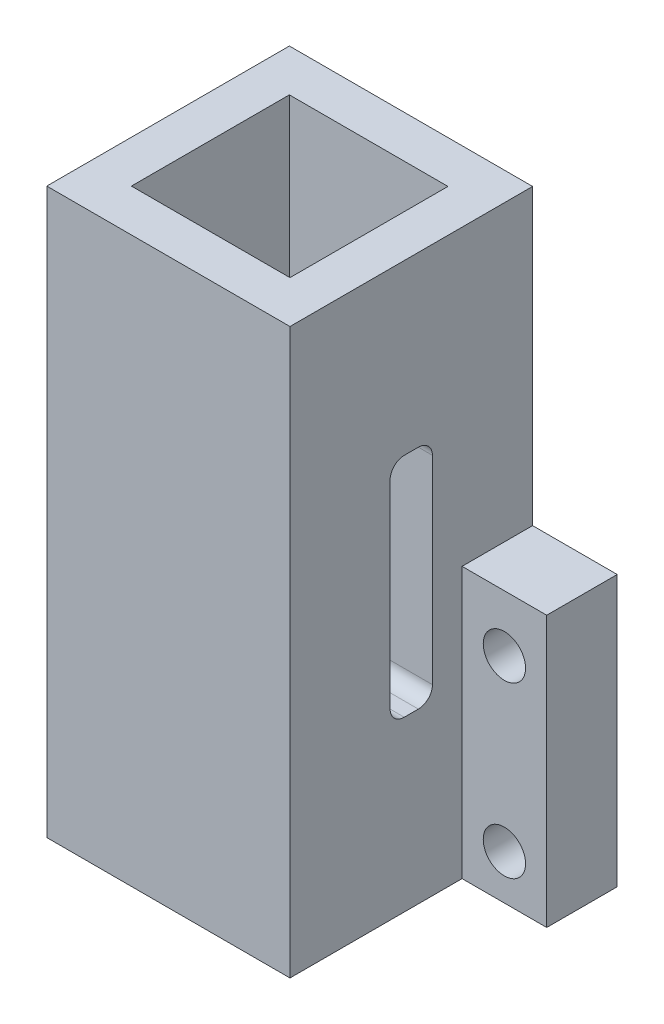
ISO-10303-21;
HEADER;
FILE_DESCRIPTION(('STEP AP214'),'2;1');
FILE_NAME('part.step','',(''),(''),'','','');
FILE_SCHEMA(('AUTOMOTIVE_DESIGN { 1 0 10303 214 1 1 1 1 }'));
ENDSEC;
DATA;
#1=APPLICATION_CONTEXT('core data for automotive mechanical design processes');
#2=APPLICATION_PROTOCOL_DEFINITION('international standard','automotive_design',2000,#1);
#3=PRODUCT_CONTEXT('',#1,'mechanical');
#4=PRODUCT('Part','Part','',(#3));
#5=PRODUCT_RELATED_PRODUCT_CATEGORY('part','',(#4));
#6=PRODUCT_DEFINITION_FORMATION('','',#4);
#7=PRODUCT_DEFINITION_CONTEXT('part definition',#1,'design');
#8=PRODUCT_DEFINITION('design','',#6,#7);
#9=PRODUCT_DEFINITION_SHAPE('','',#8);
#10=(LENGTH_UNIT() NAMED_UNIT(*) SI_UNIT(.MILLI.,.METRE.));
#11=(NAMED_UNIT(*) PLANE_ANGLE_UNIT() SI_UNIT($,.RADIAN.));
#12=(NAMED_UNIT(*) SI_UNIT($,.STERADIAN.) SOLID_ANGLE_UNIT());
#13=UNCERTAINTY_MEASURE_WITH_UNIT(LENGTH_MEASURE(1.E-05),#10,'distance_accuracy_value','');
#14=(GEOMETRIC_REPRESENTATION_CONTEXT(3) GLOBAL_UNCERTAINTY_ASSIGNED_CONTEXT((#13)) GLOBAL_UNIT_ASSIGNED_CONTEXT((#10,
#11,#12)) REPRESENTATION_CONTEXT('',''));
#15=CARTESIAN_POINT('',(0.,0.,0.));
#16=DIRECTION('',(0.,0.,1.));
#17=DIRECTION('',(1.,0.,0.));
#18=AXIS2_PLACEMENT_3D('',#15,#16,#17);
#19=CARTESIAN_POINT('',(-7.75201843167115,-9.5772566198289,17.2));
#20=DIRECTION('',(1.,0.,0.));
#21=DIRECTION('',(0.,0.,-1.));
#22=AXIS2_PLACEMENT_3D('',#19,#20,#21);
#23=PLANE('',#22);
#24=DIRECTION('',(0.,0.,-1.));
#25=VECTOR('',#24,1.);
#26=CARTESIAN_POINT('',(-7.75201843167115,18.4617180141668,7.10000000000001));
#27=LINE('',#26,#25);
#28=CARTESIAN_POINT('',(-7.75201843167115,18.4617180141668,9.1));
#29=VERTEX_POINT('',#28);
#30=CARTESIAN_POINT('',(-7.75201843167115,18.4617180141668,8.10000000000001));
#31=VERTEX_POINT('',#30);
#32=EDGE_CURVE('E427',#29,#31,#27,.T.);
#33=ORIENTED_EDGE('',*,*,#32,.F.);
#34=CARTESIAN_POINT('',(-7.75201843167115,17.4617180141668,9.1));
#35=DIRECTION('',(1.,0.,0.));
#36=DIRECTION('',(0.,0.,-1.));
#37=AXIS2_PLACEMENT_3D('',#34,#35,#36);
#38=CIRCLE('',#37,1.);
#39=CARTESIAN_POINT('',(-7.75201843167115,17.4617180141668,10.1));
#40=VERTEX_POINT('',#39);
#41=EDGE_CURVE('E415',#29,#40,#38,.T.);
#42=ORIENTED_EDGE('',*,*,#41,.T.);
#43=DIRECTION('',(0.,1.,0.));
#44=VECTOR('',#43,1.);
#45=CARTESIAN_POINT('',(-7.75201843167115,2.38376874617537,10.1));
#46=LINE('',#45,#44);
#47=CARTESIAN_POINT('',(-7.75201843167115,3.38376874617537,10.1));
#48=VERTEX_POINT('',#47);
#49=EDGE_CURVE('E436',#48,#40,#46,.T.);
#50=ORIENTED_EDGE('',*,*,#49,.F.);
#51=CARTESIAN_POINT('',(-7.75201843167115,3.38376874617537,9.1));
#52=DIRECTION('',(1.,0.,0.));
#53=DIRECTION('',(0.,0.,-1.));
#54=AXIS2_PLACEMENT_3D('',#51,#52,#53);
#55=CIRCLE('',#54,1.);
#56=CARTESIAN_POINT('',(-7.75201843167115,2.38376874617537,9.1));
#57=VERTEX_POINT('',#56);
#58=EDGE_CURVE('E411',#48,#57,#55,.T.);
#59=ORIENTED_EDGE('',*,*,#58,.T.);
#60=DIRECTION('',(0.,0.,1.));
#61=VECTOR('',#60,1.);
#62=CARTESIAN_POINT('',(-7.75201843167115,2.38376874617537,7.10000000000001));
#63=LINE('',#62,#61);
#64=CARTESIAN_POINT('',(-7.75201843167115,2.38376874617537,8.10000000000001));
#65=VERTEX_POINT('',#64);
#66=EDGE_CURVE('E450',#65,#57,#63,.T.);
#67=ORIENTED_EDGE('',*,*,#66,.F.);
#68=CARTESIAN_POINT('',(-7.75201843167115,3.38376874617537,8.10000000000001));
#69=DIRECTION('',(1.,0.,0.));
#70=DIRECTION('',(0.,0.,-1.));
#71=AXIS2_PLACEMENT_3D('',#68,#69,#70);
#72=CIRCLE('',#71,1.);
#73=CARTESIAN_POINT('',(-7.75201843167115,3.38376874617537,7.10000000000001));
#74=VERTEX_POINT('',#73);
#75=EDGE_CURVE('E419',#65,#74,#72,.T.);
#76=ORIENTED_EDGE('',*,*,#75,.T.);
#77=DIRECTION('',(0.,-1.,0.));
#78=VECTOR('',#77,1.);
#79=CARTESIAN_POINT('',(-7.75201843167115,2.38376874617537,7.10000000000001));
#80=LINE('',#79,#78);
#81=CARTESIAN_POINT('',(-7.75201843167115,17.4617180141668,7.10000000000001));
#82=VERTEX_POINT('',#81);
#83=EDGE_CURVE('E428',#82,#74,#80,.T.);
#84=ORIENTED_EDGE('',*,*,#83,.F.);
#85=CARTESIAN_POINT('',(-7.75201843167115,17.4617180141668,8.10000000000001));
#86=DIRECTION('',(1.,0.,0.));
#87=DIRECTION('',(0.,0.,-1.));
#88=AXIS2_PLACEMENT_3D('',#85,#86,#87);
#89=CIRCLE('',#88,1.);
#90=EDGE_CURVE('E40',#82,#31,#89,.T.);
#91=ORIENTED_EDGE('',*,*,#90,.T.);
#92=EDGE_LOOP('',(#33,#42,#50,#59,#67,#76,#84,#91));
#93=FACE_BOUND('',#92,.T.);
#94=DIRECTION('',(0.,0.,-1.));
#95=VECTOR('',#94,1.);
#96=CARTESIAN_POINT('',(-7.75201843167115,9.59742583286584,17.2));
#97=LINE('',#96,#95);
#98=CARTESIAN_POINT('',(-7.75201843167115,9.59742583286584,5.));
#99=VERTEX_POINT('',#98);
#100=CARTESIAN_POINT('',(-7.75201843167115,9.59742583286584,0.));
#101=VERTEX_POINT('',#100);
#102=EDGE_CURVE('E311',#99,#101,#97,.T.);
#103=ORIENTED_EDGE('',*,*,#102,.F.);
#104=DIRECTION('',(0.,-1.,0.));
#105=VECTOR('',#104,1.);
#106=CARTESIAN_POINT('',(-7.75201843167115,-9.5772566198289,5.));
#107=LINE('',#106,#105);
#108=CARTESIAN_POINT('',(-7.75201843167115,-9.5772566198289,5.));
#109=VERTEX_POINT('',#108);
#110=EDGE_CURVE('E314',#99,#109,#107,.T.);
#111=ORIENTED_EDGE('',*,*,#110,.T.);
#112=DIRECTION('',(0.,0.,-1.));
#113=VECTOR('',#112,1.);
#114=CARTESIAN_POINT('',(-7.75201843167115,-9.5772566198289,17.2));
#115=LINE('',#114,#113);
#116=CARTESIAN_POINT('',(-7.75201843167115,-9.5772566198289,17.2));
#117=VERTEX_POINT('',#116);
#118=EDGE_CURVE('E341',#117,#109,#115,.T.);
#119=ORIENTED_EDGE('',*,*,#118,.F.);
#120=DIRECTION('',(0.,-1.,0.));
#121=VECTOR('',#120,1.);
#122=CARTESIAN_POINT('',(-7.75201843167115,-9.5772566198289,17.2));
#123=LINE('',#122,#121);
#124=CARTESIAN_POINT('',(-7.75201843167115,30.4227433801711,17.2));
#125=VERTEX_POINT('',#124);
#126=EDGE_CURVE('E317',#125,#117,#123,.T.);
#127=ORIENTED_EDGE('',*,*,#126,.F.);
#128=DIRECTION('',(0.,0.,-1.));
#129=VECTOR('',#128,1.);
#130=CARTESIAN_POINT('',(-7.75201843167115,30.4227433801711,17.2));
#131=LINE('',#130,#129);
#132=CARTESIAN_POINT('',(-7.75201843167115,30.4227433801711,0.));
#133=VERTEX_POINT('',#132);
#134=EDGE_CURVE('E327',#125,#133,#131,.T.);
#135=ORIENTED_EDGE('',*,*,#134,.T.);
#136=DIRECTION('',(0.,-1.,0.));
#137=VECTOR('',#136,1.);
#138=CARTESIAN_POINT('',(-7.75201843167115,-9.5772566198289,0.));
#139=LINE('',#138,#137);
#140=EDGE_CURVE('E316',#133,#101,#139,.T.);
#141=ORIENTED_EDGE('',*,*,#140,.T.);
#142=EDGE_LOOP('',(#103,#111,#119,#127,#135,#141));
#143=FACE_BOUND('',#142,.T.);
#144=ADVANCED_FACE('F32',(#93,#143),#23,.F.);
#145=CARTESIAN_POINT('',(9.49084293443147,-9.5772566198289,17.2));
#146=DIRECTION('',(-1.,0.,0.));
#147=DIRECTION('',(0.,-1.,0.));
#148=AXIS2_PLACEMENT_3D('',#145,#146,#147);
#149=PLANE('',#148);
#150=DIRECTION('',(0.,0.,-1.));
#151=VECTOR('',#150,1.);
#152=CARTESIAN_POINT('',(9.49084293443147,2.38376874617537,7.10000000000001));
#153=LINE('',#152,#151);
#154=CARTESIAN_POINT('',(9.49084293443147,2.38376874617537,9.1));
#155=VERTEX_POINT('',#154);
#156=CARTESIAN_POINT('',(9.49084293443147,2.38376874617537,8.10000000000001));
#157=VERTEX_POINT('',#156);
#158=EDGE_CURVE('E456',#155,#157,#153,.T.);
#159=ORIENTED_EDGE('',*,*,#158,.F.);
#160=CARTESIAN_POINT('',(9.49084293443147,3.38376874617537,9.1));
#161=DIRECTION('',(-1.,0.,0.));
#162=DIRECTION('',(0.,-1.,0.));
#163=AXIS2_PLACEMENT_3D('',#160,#161,#162);
#164=CIRCLE('',#163,1.);
#165=CARTESIAN_POINT('',(9.49084293443147,3.38376874617537,10.1));
#166=VERTEX_POINT('',#165);
#167=EDGE_CURVE('E405',#155,#166,#164,.T.);
#168=ORIENTED_EDGE('',*,*,#167,.T.);
#169=DIRECTION('',(0.,-1.,0.));
#170=VECTOR('',#169,1.);
#171=CARTESIAN_POINT('',(9.49084293443147,2.38376874617537,10.1));
#172=LINE('',#171,#170);
#173=CARTESIAN_POINT('',(9.49084293443147,17.4617180141668,10.1));
#174=VERTEX_POINT('',#173);
#175=EDGE_CURVE('E464',#174,#166,#172,.T.);
#176=ORIENTED_EDGE('',*,*,#175,.F.);
#177=CARTESIAN_POINT('',(9.49084293443147,17.4617180141668,9.1));
#178=DIRECTION('',(-1.,0.,0.));
#179=DIRECTION('',(0.,-1.,0.));
#180=AXIS2_PLACEMENT_3D('',#177,#178,#179);
#181=CIRCLE('',#180,1.);
#182=CARTESIAN_POINT('',(9.49084293443147,18.4617180141668,9.1));
#183=VERTEX_POINT('',#182);
#184=EDGE_CURVE('E397',#174,#183,#181,.T.);
#185=ORIENTED_EDGE('',*,*,#184,.T.);
#186=DIRECTION('',(0.,0.,1.));
#187=VECTOR('',#186,1.);
#188=CARTESIAN_POINT('',(9.49084293443147,18.4617180141668,7.10000000000001));
#189=LINE('',#188,#187);
#190=CARTESIAN_POINT('',(9.49084293443147,18.4617180141668,8.10000000000001));
#191=VERTEX_POINT('',#190);
#192=EDGE_CURVE('E460',#191,#183,#189,.T.);
#193=ORIENTED_EDGE('',*,*,#192,.F.);
#194=CARTESIAN_POINT('',(9.49084293443147,17.4617180141668,8.10000000000001));
#195=DIRECTION('',(-1.,0.,0.));
#196=DIRECTION('',(0.,-1.,0.));
#197=AXIS2_PLACEMENT_3D('',#194,#195,#196);
#198=CIRCLE('',#197,1.);
#199=CARTESIAN_POINT('',(9.49084293443147,17.4617180141668,7.10000000000001));
#200=VERTEX_POINT('',#199);
#201=EDGE_CURVE('E401',#191,#200,#198,.T.);
#202=ORIENTED_EDGE('',*,*,#201,.T.);
#203=DIRECTION('',(0.,1.,0.));
#204=VECTOR('',#203,1.);
#205=CARTESIAN_POINT('',(9.49084293443147,2.38376874617537,7.10000000000001));
#206=LINE('',#205,#204);
#207=CARTESIAN_POINT('',(9.49084293443147,3.38376874617537,7.10000000000001));
#208=VERTEX_POINT('',#207);
#209=EDGE_CURVE('E453',#208,#200,#206,.T.);
#210=ORIENTED_EDGE('',*,*,#209,.F.);
#211=CARTESIAN_POINT('',(9.49084293443147,3.38376874617537,8.10000000000001));
#212=DIRECTION('',(-1.,0.,0.));
#213=DIRECTION('',(0.,-1.,0.));
#214=AXIS2_PLACEMENT_3D('',#211,#212,#213);
#215=CIRCLE('',#214,1.);
#216=EDGE_CURVE('E409',#208,#157,#215,.T.);
#217=ORIENTED_EDGE('',*,*,#216,.T.);
#218=EDGE_LOOP('',(#159,#168,#176,#185,#193,#202,#210,#217));
#219=FACE_BOUND('',#218,.T.);
#220=DIRECTION('',(0.,0.,1.));
#221=VECTOR('',#220,1.);
#222=CARTESIAN_POINT('',(9.49084293443147,9.59742583286584,17.2));
#223=LINE('',#222,#221);
#224=CARTESIAN_POINT('',(9.49084293443147,9.59742583286584,0.));
#225=VERTEX_POINT('',#224);
#226=CARTESIAN_POINT('',(9.49084293443147,9.59742583286584,5.));
#227=VERTEX_POINT('',#226);
#228=EDGE_CURVE('E308',#225,#227,#223,.T.);
#229=ORIENTED_EDGE('',*,*,#228,.F.);
#230=DIRECTION('',(0.,1.,0.));
#231=VECTOR('',#230,1.);
#232=CARTESIAN_POINT('',(9.49084293443147,-9.5772566198289,0.));
#233=LINE('',#232,#231);
#234=CARTESIAN_POINT('',(9.49084293443147,30.4227433801711,0.));
#235=VERTEX_POINT('',#234);
#236=EDGE_CURVE('E331',#225,#235,#233,.T.);
#237=ORIENTED_EDGE('',*,*,#236,.T.);
#238=DIRECTION('',(0.,0.,-1.));
#239=VECTOR('',#238,1.);
#240=CARTESIAN_POINT('',(9.49084293443147,30.4227433801711,17.2));
#241=LINE('',#240,#239);
#242=CARTESIAN_POINT('',(9.49084293443147,30.4227433801711,17.2));
#243=VERTEX_POINT('',#242);
#244=EDGE_CURVE('E336',#243,#235,#241,.T.);
#245=ORIENTED_EDGE('',*,*,#244,.F.);
#246=DIRECTION('',(0.,1.,0.));
#247=VECTOR('',#246,1.);
#248=CARTESIAN_POINT('',(9.49084293443147,-9.5772566198289,17.2));
#249=LINE('',#248,#247);
#250=CARTESIAN_POINT('',(9.49084293443147,-9.5772566198289,17.2));
#251=VERTEX_POINT('',#250);
#252=EDGE_CURVE('E323',#251,#243,#249,.T.);
#253=ORIENTED_EDGE('',*,*,#252,.F.);
#254=DIRECTION('',(0.,0.,-1.));
#255=VECTOR('',#254,1.);
#256=CARTESIAN_POINT('',(9.49084293443147,-9.5772566198289,17.2));
#257=LINE('',#256,#255);
#258=CARTESIAN_POINT('',(9.49084293443147,-9.5772566198289,5.));
#259=VERTEX_POINT('',#258);
#260=EDGE_CURVE('E339',#251,#259,#257,.T.);
#261=ORIENTED_EDGE('',*,*,#260,.T.);
#262=DIRECTION('',(0.,1.,0.));
#263=VECTOR('',#262,1.);
#264=CARTESIAN_POINT('',(9.49084293443147,-9.5772566198289,5.));
#265=LINE('',#264,#263);
#266=EDGE_CURVE('E344',#259,#227,#265,.T.);
#267=ORIENTED_EDGE('',*,*,#266,.T.);
#268=EDGE_LOOP('',(#229,#237,#245,#253,#261,#267));
#269=FACE_BOUND('',#268,.T.);
#270=ADVANCED_FACE('F488',(#219,#269),#149,.F.);
#271=CARTESIAN_POINT('',(-7.75201843167115,-9.5772566198289,17.2));
#272=DIRECTION('',(0.,1.,0.));
#273=DIRECTION('',(0.,0.,1.));
#274=AXIS2_PLACEMENT_3D('',#271,#272,#273);
#275=PLANE('',#274);
#276=ORIENTED_EDGE('',*,*,#118,.T.);
#277=DIRECTION('',(1.,0.,0.));
#278=VECTOR('',#277,1.);
#279=CARTESIAN_POINT('',(-13.7520184316711,-9.5772566198289,5.));
#280=LINE('',#279,#278);
#281=CARTESIAN_POINT('',(-13.7520184316711,-9.5772566198289,5.));
#282=VERTEX_POINT('',#281);
#283=EDGE_CURVE('E280',#282,#109,#280,.T.);
#284=ORIENTED_EDGE('',*,*,#283,.F.);
#285=DIRECTION('',(0.,0.,-1.));
#286=VECTOR('',#285,1.);
#287=CARTESIAN_POINT('',(-13.7520184316711,-9.5772566198289,5.));
#288=LINE('',#287,#286);
#289=CARTESIAN_POINT('',(-13.7520184316711,-9.5772566198289,0.));
#290=VERTEX_POINT('',#289);
#291=EDGE_CURVE('E305',#282,#290,#288,.T.);
#292=ORIENTED_EDGE('',*,*,#291,.T.);
#293=DIRECTION('',(1.,0.,0.));
#294=VECTOR('',#293,1.);
#295=CARTESIAN_POINT('',(-7.75201843167115,-9.5772566198289,0.));
#296=LINE('',#295,#294);
#297=CARTESIAN_POINT('',(15.4908429344315,-9.5772566198289,0.));
#298=VERTEX_POINT('',#297);
#299=EDGE_CURVE('E329',#290,#298,#296,.T.);
#300=ORIENTED_EDGE('',*,*,#299,.T.);
#301=DIRECTION('',(0.,0.,-1.));
#302=VECTOR('',#301,1.);
#303=CARTESIAN_POINT('',(15.4908429344315,-9.5772566198289,5.));
#304=LINE('',#303,#302);
#305=CARTESIAN_POINT('',(15.4908429344315,-9.5772566198289,5.));
#306=VERTEX_POINT('',#305);
#307=EDGE_CURVE('E302',#306,#298,#304,.T.);
#308=ORIENTED_EDGE('',*,*,#307,.F.);
#309=EDGE_CURVE('E278',#259,#306,#280,.T.);
#310=ORIENTED_EDGE('',*,*,#309,.F.);
#311=ORIENTED_EDGE('',*,*,#260,.F.);
#312=DIRECTION('',(1.,0.,0.));
#313=VECTOR('',#312,1.);
#314=CARTESIAN_POINT('',(-7.75201843167115,-9.5772566198289,17.2));
#315=LINE('',#314,#313);
#316=EDGE_CURVE('E320',#117,#251,#315,.T.);
#317=ORIENTED_EDGE('',*,*,#316,.F.);
#318=EDGE_LOOP('',(#276,#284,#292,#300,#308,#310,#311,#317));
#319=FACE_BOUND('',#318,.T.);
#320=ADVANCED_FACE('F572',(#319),#275,.F.);
#321=CARTESIAN_POINT('',(-7.75201843167115,30.4227433801711,17.2));
#322=DIRECTION('',(0.,-1.,0.));
#323=DIRECTION('',(0.,0.,-1.));
#324=AXIS2_PLACEMENT_3D('',#321,#322,#323);
#325=PLANE('',#324);
#326=DIRECTION('',(-1.,0.,0.));
#327=VECTOR('',#326,1.);
#328=CARTESIAN_POINT('',(-4.75201843167115,30.4227433801711,3.));
#329=LINE('',#328,#327);
#330=CARTESIAN_POINT('',(6.49084293443147,30.4227433801711,3.));
#331=VERTEX_POINT('',#330);
#332=CARTESIAN_POINT('',(-4.75201843167115,30.4227433801711,3.));
#333=VERTEX_POINT('',#332);
#334=EDGE_CURVE('E265',#331,#333,#329,.T.);
#335=ORIENTED_EDGE('',*,*,#334,.F.);
#336=DIRECTION('',(0.,0.,-1.));
#337=VECTOR('',#336,1.);
#338=CARTESIAN_POINT('',(6.49084293443147,30.4227433801711,3.));
#339=LINE('',#338,#337);
#340=CARTESIAN_POINT('',(6.49084293443147,30.4227433801711,14.2));
#341=VERTEX_POINT('',#340);
#342=EDGE_CURVE('E236',#341,#331,#339,.T.);
#343=ORIENTED_EDGE('',*,*,#342,.F.);
#344=DIRECTION('',(1.,0.,0.));
#345=VECTOR('',#344,1.);
#346=CARTESIAN_POINT('',(-4.75201843167115,30.4227433801711,14.2));
#347=LINE('',#346,#345);
#348=CARTESIAN_POINT('',(-4.75201843167115,30.4227433801711,14.2));
#349=VERTEX_POINT('',#348);
#350=EDGE_CURVE('E253',#349,#341,#347,.T.);
#351=ORIENTED_EDGE('',*,*,#350,.F.);
#352=DIRECTION('',(0.,0.,1.));
#353=VECTOR('',#352,1.);
#354=CARTESIAN_POINT('',(-4.75201843167115,30.4227433801711,3.));
#355=LINE('',#354,#353);
#356=EDGE_CURVE('E256',#333,#349,#355,.T.);
#357=ORIENTED_EDGE('',*,*,#356,.F.);
#358=EDGE_LOOP('',(#335,#343,#351,#357));
#359=FACE_BOUND('',#358,.T.);
#360=DIRECTION('',(-1.,0.,0.));
#361=VECTOR('',#360,1.);
#362=CARTESIAN_POINT('',(-7.75201843167115,30.4227433801711,0.));
#363=LINE('',#362,#361);
#364=EDGE_CURVE('E321',#235,#133,#363,.T.);
#365=ORIENTED_EDGE('',*,*,#364,.T.);
#366=ORIENTED_EDGE('',*,*,#134,.F.);
#367=DIRECTION('',(-1.,0.,0.));
#368=VECTOR('',#367,1.);
#369=CARTESIAN_POINT('',(-7.75201843167115,30.4227433801711,17.2));
#370=LINE('',#369,#368);
#371=EDGE_CURVE('E325',#243,#125,#370,.T.);
#372=ORIENTED_EDGE('',*,*,#371,.F.);
#373=ORIENTED_EDGE('',*,*,#244,.T.);
#374=EDGE_LOOP('',(#365,#366,#372,#373));
#375=FACE_BOUND('',#374,.T.);
#376=ADVANCED_FACE('F585',(#359,#375),#325,.F.);
#377=CARTESIAN_POINT('',(0.,0.,17.2));
#378=DIRECTION('',(0.,0.,-1.));
#379=DIRECTION('',(-1.,0.,0.));
#380=AXIS2_PLACEMENT_3D('',#377,#378,#379);
#381=PLANE('',#380);
#382=ORIENTED_EDGE('',*,*,#126,.T.);
#383=ORIENTED_EDGE('',*,*,#316,.T.);
#384=ORIENTED_EDGE('',*,*,#252,.T.);
#385=ORIENTED_EDGE('',*,*,#371,.T.);
#386=EDGE_LOOP('',(#382,#383,#384,#385));
#387=FACE_BOUND('',#386,.T.);
#388=ADVANCED_FACE('F601',(#387),#381,.F.);
#389=CARTESIAN_POINT('',(0.,0.,0.));
#390=DIRECTION('',(0.,0.,-1.));
#391=DIRECTION('',(-1.,0.,0.));
#392=AXIS2_PLACEMENT_3D('',#389,#390,#391);
#393=PLANE('',#392);
#394=CARTESIAN_POINT('',(12.4908429344315,5.59742583286585,0.));
#395=DIRECTION('',(0.,0.,1.));
#396=DIRECTION('',(-1.,0.,0.));
#397=AXIS2_PLACEMENT_3D('',#394,#395,#396);
#398=CIRCLE('',#397,1.5);
#399=CARTESIAN_POINT('',(10.9908429344315,5.59742583286585,0.));
#400=VERTEX_POINT('',#399);
#401=EDGE_CURVE('E542',#400,#400,#398,.T.);
#402=ORIENTED_EDGE('',*,*,#401,.T.);
#403=EDGE_LOOP('',(#402));
#404=FACE_BOUND('',#403,.T.);
#405=CARTESIAN_POINT('',(12.4908429344315,-6.41146060411537,0.));
#406=DIRECTION('',(0.,0.,1.));
#407=DIRECTION('',(-1.,0.,0.));
#408=AXIS2_PLACEMENT_3D('',#405,#406,#407);
#409=CIRCLE('',#408,1.5);
#410=CARTESIAN_POINT('',(10.9908429344315,-6.41146060411537,0.));
#411=VERTEX_POINT('',#410);
#412=EDGE_CURVE('E536',#411,#411,#409,.T.);
#413=ORIENTED_EDGE('',*,*,#412,.T.);
#414=EDGE_LOOP('',(#413));
#415=FACE_BOUND('',#414,.T.);
#416=CARTESIAN_POINT('',(-10.7520184316711,-6.41146060411538,0.));
#417=DIRECTION('',(0.,0.,1.));
#418=DIRECTION('',(1.,0.,0.));
#419=AXIS2_PLACEMENT_3D('',#416,#417,#418);
#420=CIRCLE('',#419,1.5);
#421=CARTESIAN_POINT('',(-9.25201843167114,-6.41146060411538,0.));
#422=VERTEX_POINT('',#421);
#423=EDGE_CURVE('E530',#422,#422,#420,.T.);
#424=ORIENTED_EDGE('',*,*,#423,.T.);
#425=EDGE_LOOP('',(#424));
#426=FACE_BOUND('',#425,.T.);
#427=CARTESIAN_POINT('',(-10.7520184316711,5.59742583286584,0.));
#428=DIRECTION('',(0.,0.,1.));
#429=DIRECTION('',(1.,0.,0.));
#430=AXIS2_PLACEMENT_3D('',#427,#428,#429);
#431=CIRCLE('',#430,1.5);
#432=CARTESIAN_POINT('',(-9.25201843167114,5.59742583286584,0.));
#433=VERTEX_POINT('',#432);
#434=EDGE_CURVE('E521',#433,#433,#431,.T.);
#435=ORIENTED_EDGE('',*,*,#434,.T.);
#436=EDGE_LOOP('',(#435));
#437=FACE_BOUND('',#436,.T.);
#438=ORIENTED_EDGE('',*,*,#299,.F.);
#439=DIRECTION('',(0.,-1.,0.));
#440=VECTOR('',#439,1.);
#441=CARTESIAN_POINT('',(-13.7520184316711,9.59742583286584,0.));
#442=LINE('',#441,#440);
#443=CARTESIAN_POINT('',(-13.7520184316711,9.59742583286584,0.));
#444=VERTEX_POINT('',#443);
#445=EDGE_CURVE('E271',#444,#290,#442,.T.);
#446=ORIENTED_EDGE('',*,*,#445,.F.);
#447=DIRECTION('',(-1.,0.,0.));
#448=VECTOR('',#447,1.);
#449=CARTESIAN_POINT('',(-13.7520184316711,9.59742583286584,0.));
#450=LINE('',#449,#448);
#451=EDGE_CURVE('E294',#101,#444,#450,.T.);
#452=ORIENTED_EDGE('',*,*,#451,.F.);
#453=ORIENTED_EDGE('',*,*,#140,.F.);
#454=ORIENTED_EDGE('',*,*,#364,.F.);
#455=ORIENTED_EDGE('',*,*,#236,.F.);
#456=CARTESIAN_POINT('',(15.4908429344315,9.59742583286584,0.));
#457=VERTEX_POINT('',#456);
#458=EDGE_CURVE('E279',#457,#225,#450,.T.);
#459=ORIENTED_EDGE('',*,*,#458,.F.);
#460=DIRECTION('',(0.,1.,0.));
#461=VECTOR('',#460,1.);
#462=CARTESIAN_POINT('',(15.4908429344315,9.59742583286584,0.));
#463=LINE('',#462,#461);
#464=EDGE_CURVE('E292',#298,#457,#463,.T.);
#465=ORIENTED_EDGE('',*,*,#464,.F.);
#466=EDGE_LOOP('',(#438,#446,#452,#453,#454,#455,#459,#465));
#467=FACE_BOUND('',#466,.T.);
#468=ADVANCED_FACE('F546',(#404,#415,#426,#437,#467),#393,.T.);
#469=CARTESIAN_POINT('',(15.4908429344315,9.59742583286584,5.));
#470=DIRECTION('',(-1.,0.,0.));
#471=DIRECTION('',(0.,0.,1.));
#472=AXIS2_PLACEMENT_3D('',#469,#470,#471);
#473=PLANE('',#472);
#474=ORIENTED_EDGE('',*,*,#464,.T.);
#475=DIRECTION('',(0.,0.,-1.));
#476=VECTOR('',#475,1.);
#477=CARTESIAN_POINT('',(15.4908429344315,9.59742583286584,5.));
#478=LINE('',#477,#476);
#479=CARTESIAN_POINT('',(15.4908429344315,9.59742583286584,5.));
#480=VERTEX_POINT('',#479);
#481=EDGE_CURVE('E299',#480,#457,#478,.T.);
#482=ORIENTED_EDGE('',*,*,#481,.F.);
#483=DIRECTION('',(0.,1.,0.));
#484=VECTOR('',#483,1.);
#485=CARTESIAN_POINT('',(15.4908429344315,9.59742583286584,5.));
#486=LINE('',#485,#484);
#487=EDGE_CURVE('E283',#306,#480,#486,.T.);
#488=ORIENTED_EDGE('',*,*,#487,.F.);
#489=ORIENTED_EDGE('',*,*,#307,.T.);
#490=EDGE_LOOP('',(#474,#482,#488,#489));
#491=FACE_BOUND('',#490,.T.);
#492=ADVANCED_FACE('F560',(#491),#473,.F.);
#493=CARTESIAN_POINT('',(0.,0.,5.));
#494=DIRECTION('',(0.,0.,1.));
#495=DIRECTION('',(1.,0.,0.));
#496=AXIS2_PLACEMENT_3D('',#493,#494,#495);
#497=PLANE('',#496);
#498=CARTESIAN_POINT('',(12.4908429344315,5.59742583286585,5.));
#499=DIRECTION('',(0.,0.,1.));
#500=DIRECTION('',(1.,0.,0.));
#501=AXIS2_PLACEMENT_3D('',#498,#499,#500);
#502=CIRCLE('',#501,1.5);
#503=CARTESIAN_POINT('',(13.9908429344315,5.59742583286585,5.));
#504=VERTEX_POINT('',#503);
#505=EDGE_CURVE('E539',#504,#504,#502,.T.);
#506=ORIENTED_EDGE('',*,*,#505,.F.);
#507=EDGE_LOOP('',(#506));
#508=FACE_BOUND('',#507,.T.);
#509=CARTESIAN_POINT('',(12.4908429344315,-6.41146060411537,5.));
#510=DIRECTION('',(0.,0.,1.));
#511=DIRECTION('',(1.,0.,0.));
#512=AXIS2_PLACEMENT_3D('',#509,#510,#511);
#513=CIRCLE('',#512,1.5);
#514=CARTESIAN_POINT('',(13.9908429344315,-6.41146060411537,5.));
#515=VERTEX_POINT('',#514);
#516=EDGE_CURVE('E533',#515,#515,#513,.T.);
#517=ORIENTED_EDGE('',*,*,#516,.F.);
#518=EDGE_LOOP('',(#517));
#519=FACE_BOUND('',#518,.T.);
#520=ORIENTED_EDGE('',*,*,#266,.F.);
#521=ORIENTED_EDGE('',*,*,#309,.T.);
#522=ORIENTED_EDGE('',*,*,#487,.T.);
#523=DIRECTION('',(-1.,0.,0.));
#524=VECTOR('',#523,1.);
#525=CARTESIAN_POINT('',(-13.7520184316711,9.59742583286584,5.));
#526=LINE('',#525,#524);
#527=EDGE_CURVE('E286',#480,#227,#526,.T.);
#528=ORIENTED_EDGE('',*,*,#527,.T.);
#529=EDGE_LOOP('',(#520,#521,#522,#528));
#530=FACE_BOUND('',#529,.T.);
#531=ADVANCED_FACE('F556',(#508,#519,#530),#497,.T.);
#532=CARTESIAN_POINT('',(-13.7520184316711,9.59742583286584,5.));
#533=DIRECTION('',(0.,-1.,0.));
#534=DIRECTION('',(0.,0.,-1.));
#535=AXIS2_PLACEMENT_3D('',#532,#533,#534);
#536=PLANE('',#535);
#537=ORIENTED_EDGE('',*,*,#458,.T.);
#538=ORIENTED_EDGE('',*,*,#228,.T.);
#539=ORIENTED_EDGE('',*,*,#527,.F.);
#540=ORIENTED_EDGE('',*,*,#481,.T.);
#541=EDGE_LOOP('',(#537,#538,#539,#540));
#542=FACE_BOUND('',#541,.T.);
#543=ADVANCED_FACE('F559',(#542),#536,.F.);
#544=CARTESIAN_POINT('',(-10.7520184316711,-6.41146060411538,5.));
#545=DIRECTION('',(0.,0.,1.));
#546=DIRECTION('',(1.,0.,0.));
#547=AXIS2_PLACEMENT_3D('',#544,#545,#546);
#548=CIRCLE('',#547,1.5);
#549=CARTESIAN_POINT('',(-9.25201843167114,-6.41146060411538,5.));
#550=VERTEX_POINT('',#549);
#551=EDGE_CURVE('E525',#550,#550,#548,.T.);
#552=ORIENTED_EDGE('',*,*,#551,.F.);
#553=EDGE_LOOP('',(#552));
#554=FACE_BOUND('',#553,.T.);
#555=CARTESIAN_POINT('',(-10.7520184316711,5.59742583286584,5.));
#556=DIRECTION('',(0.,0.,1.));
#557=DIRECTION('',(1.,0.,0.));
#558=AXIS2_PLACEMENT_3D('',#555,#556,#557);
#559=CIRCLE('',#558,1.5);
#560=CARTESIAN_POINT('',(-9.25201843167114,5.59742583286584,5.));
#561=VERTEX_POINT('',#560);
#562=EDGE_CURVE('E517',#561,#561,#559,.T.);
#563=ORIENTED_EDGE('',*,*,#562,.F.);
#564=EDGE_LOOP('',(#563));
#565=FACE_BOUND('',#564,.T.);
#566=ORIENTED_EDGE('',*,*,#110,.F.);
#567=CARTESIAN_POINT('',(-13.7520184316711,9.59742583286584,5.));
#568=VERTEX_POINT('',#567);
#569=EDGE_CURVE('E285',#99,#568,#526,.T.);
#570=ORIENTED_EDGE('',*,*,#569,.T.);
#571=DIRECTION('',(0.,-1.,0.));
#572=VECTOR('',#571,1.);
#573=CARTESIAN_POINT('',(-13.7520184316711,9.59742583286584,5.));
#574=LINE('',#573,#572);
#575=EDGE_CURVE('E275',#568,#282,#574,.T.);
#576=ORIENTED_EDGE('',*,*,#575,.T.);
#577=ORIENTED_EDGE('',*,*,#283,.T.);
#578=EDGE_LOOP('',(#566,#570,#576,#577));
#579=FACE_BOUND('',#578,.T.);
#580=ADVANCED_FACE('F562',(#554,#565,#579),#497,.T.);
#581=ORIENTED_EDGE('',*,*,#569,.F.);
#582=ORIENTED_EDGE('',*,*,#102,.T.);
#583=ORIENTED_EDGE('',*,*,#451,.T.);
#584=DIRECTION('',(0.,0.,-1.));
#585=VECTOR('',#584,1.);
#586=CARTESIAN_POINT('',(-13.7520184316711,9.59742583286584,5.));
#587=LINE('',#586,#585);
#588=EDGE_CURVE('E289',#568,#444,#587,.T.);
#589=ORIENTED_EDGE('',*,*,#588,.F.);
#590=EDGE_LOOP('',(#581,#582,#583,#589));
#591=FACE_BOUND('',#590,.T.);
#592=ADVANCED_FACE('F594',(#591),#536,.F.);
#593=CARTESIAN_POINT('',(-13.7520184316711,9.59742583286584,5.));
#594=DIRECTION('',(1.,0.,0.));
#595=DIRECTION('',(0.,0.,-1.));
#596=AXIS2_PLACEMENT_3D('',#593,#594,#595);
#597=PLANE('',#596);
#598=ORIENTED_EDGE('',*,*,#445,.T.);
#599=ORIENTED_EDGE('',*,*,#291,.F.);
#600=ORIENTED_EDGE('',*,*,#575,.F.);
#601=ORIENTED_EDGE('',*,*,#588,.T.);
#602=EDGE_LOOP('',(#598,#599,#600,#601));
#603=FACE_BOUND('',#602,.T.);
#604=ADVANCED_FACE('F678',(#603),#597,.F.);
#605=CARTESIAN_POINT('',(6.49084293443147,-6.5772566198289,3.));
#606=DIRECTION('',(1.,0.,0.));
#607=DIRECTION('',(0.,0.,-1.));
#608=AXIS2_PLACEMENT_3D('',#605,#606,#607);
#609=PLANE('',#608);
#610=DIRECTION('',(0.,1.,0.));
#611=VECTOR('',#610,1.);
#612=CARTESIAN_POINT('',(6.49084293443147,-6.5772566198289,7.10000000000001));
#613=LINE('',#612,#611);
#614=CARTESIAN_POINT('',(6.49084293443147,3.38376874617537,7.10000000000001));
#615=VERTEX_POINT('',#614);
#616=CARTESIAN_POINT('',(6.49084293443147,17.4617180141668,7.10000000000001));
#617=VERTEX_POINT('',#616);
#618=EDGE_CURVE('E467',#615,#617,#613,.T.);
#619=ORIENTED_EDGE('',*,*,#618,.T.);
#620=CARTESIAN_POINT('',(6.49084293443147,17.4617180141668,8.10000000000001));
#621=DIRECTION('',(1.,0.,0.));
#622=DIRECTION('',(0.,0.,-1.));
#623=AXIS2_PLACEMENT_3D('',#620,#621,#622);
#624=CIRCLE('',#623,1.);
#625=CARTESIAN_POINT('',(6.49084293443147,18.4617180141668,8.10000000000001));
#626=VERTEX_POINT('',#625);
#627=EDGE_CURVE('E399',#617,#626,#624,.T.);
#628=ORIENTED_EDGE('',*,*,#627,.T.);
#629=DIRECTION('',(0.,0.,1.));
#630=VECTOR('',#629,1.);
#631=CARTESIAN_POINT('',(6.49084293443147,18.4617180141668,3.));
#632=LINE('',#631,#630);
#633=CARTESIAN_POINT('',(6.49084293443147,18.4617180141668,9.1));
#634=VERTEX_POINT('',#633);
#635=EDGE_CURVE('E463',#626,#634,#632,.T.);
#636=ORIENTED_EDGE('',*,*,#635,.T.);
#637=CARTESIAN_POINT('',(6.49084293443147,17.4617180141668,9.1));
#638=DIRECTION('',(1.,0.,0.));
#639=DIRECTION('',(0.,0.,-1.));
#640=AXIS2_PLACEMENT_3D('',#637,#638,#639);
#641=CIRCLE('',#640,1.);
#642=CARTESIAN_POINT('',(6.49084293443147,17.4617180141668,10.1));
#643=VERTEX_POINT('',#642);
#644=EDGE_CURVE('E395',#634,#643,#641,.T.);
#645=ORIENTED_EDGE('',*,*,#644,.T.);
#646=DIRECTION('',(0.,-1.,0.));
#647=VECTOR('',#646,1.);
#648=CARTESIAN_POINT('',(6.49084293443147,-6.5772566198289,10.1));
#649=LINE('',#648,#647);
#650=CARTESIAN_POINT('',(6.49084293443147,3.38376874617537,10.1));
#651=VERTEX_POINT('',#650);
#652=EDGE_CURVE('E259',#643,#651,#649,.T.);
#653=ORIENTED_EDGE('',*,*,#652,.T.);
#654=CARTESIAN_POINT('',(6.49084293443147,3.38376874617537,9.1));
#655=DIRECTION('',(1.,0.,0.));
#656=DIRECTION('',(0.,0.,-1.));
#657=AXIS2_PLACEMENT_3D('',#654,#655,#656);
#658=CIRCLE('',#657,1.);
#659=CARTESIAN_POINT('',(6.49084293443147,2.38376874617537,9.1));
#660=VERTEX_POINT('',#659);
#661=EDGE_CURVE('E403',#651,#660,#658,.T.);
#662=ORIENTED_EDGE('',*,*,#661,.T.);
#663=DIRECTION('',(0.,0.,-1.));
#664=VECTOR('',#663,1.);
#665=CARTESIAN_POINT('',(6.49084293443147,2.38376874617537,3.));
#666=LINE('',#665,#664);
#667=CARTESIAN_POINT('',(6.49084293443147,2.38376874617537,8.10000000000001));
#668=VERTEX_POINT('',#667);
#669=EDGE_CURVE('E469',#660,#668,#666,.T.);
#670=ORIENTED_EDGE('',*,*,#669,.T.);
#671=CARTESIAN_POINT('',(6.49084293443147,3.38376874617537,8.10000000000001));
#672=DIRECTION('',(1.,0.,0.));
#673=DIRECTION('',(0.,0.,-1.));
#674=AXIS2_PLACEMENT_3D('',#671,#672,#673);
#675=CIRCLE('',#674,1.);
#676=EDGE_CURVE('E407',#668,#615,#675,.T.);
#677=ORIENTED_EDGE('',*,*,#676,.T.);
#678=EDGE_LOOP('',(#619,#628,#636,#645,#653,#662,#670,#677));
#679=FACE_BOUND('',#678,.T.);
#680=ORIENTED_EDGE('',*,*,#342,.T.);
#681=DIRECTION('',(0.,1.,0.));
#682=VECTOR('',#681,1.);
#683=CARTESIAN_POINT('',(6.49084293443147,-6.5772566198289,3.));
#684=LINE('',#683,#682);
#685=CARTESIAN_POINT('',(6.49084293443147,-6.5772566198289,3.));
#686=VERTEX_POINT('',#685);
#687=EDGE_CURVE('E229',#686,#331,#684,.T.);
#688=ORIENTED_EDGE('',*,*,#687,.F.);
#689=DIRECTION('',(0.,0.,-1.));
#690=VECTOR('',#689,1.);
#691=CARTESIAN_POINT('',(6.49084293443147,-6.5772566198289,3.));
#692=LINE('',#691,#690);
#693=CARTESIAN_POINT('',(6.49084293443147,-6.5772566198289,14.2));
#694=VERTEX_POINT('',#693);
#695=EDGE_CURVE('E233',#694,#686,#692,.T.);
#696=ORIENTED_EDGE('',*,*,#695,.F.);
#697=DIRECTION('',(0.,1.,0.));
#698=VECTOR('',#697,1.);
#699=CARTESIAN_POINT('',(6.49084293443147,-6.5772566198289,14.2));
#700=LINE('',#699,#698);
#701=EDGE_CURVE('E269',#694,#341,#700,.T.);
#702=ORIENTED_EDGE('',*,*,#701,.T.);
#703=EDGE_LOOP('',(#680,#688,#696,#702));
#704=FACE_BOUND('',#703,.T.);
#705=ADVANCED_FACE('F231',(#679,#704),#609,.F.);
#706=CARTESIAN_POINT('',(-4.75201843167115,-6.5772566198289,14.2));
#707=DIRECTION('',(0.,0.,1.));
#708=DIRECTION('',(1.,0.,0.));
#709=AXIS2_PLACEMENT_3D('',#706,#707,#708);
#710=PLANE('',#709);
#711=ORIENTED_EDGE('',*,*,#350,.T.);
#712=ORIENTED_EDGE('',*,*,#701,.F.);
#713=DIRECTION('',(1.,0.,0.));
#714=VECTOR('',#713,1.);
#715=CARTESIAN_POINT('',(-4.75201843167115,-6.5772566198289,14.2));
#716=LINE('',#715,#714);
#717=CARTESIAN_POINT('',(-4.75201843167115,-6.5772566198289,14.2));
#718=VERTEX_POINT('',#717);
#719=EDGE_CURVE('E241',#718,#694,#716,.T.);
#720=ORIENTED_EDGE('',*,*,#719,.F.);
#721=DIRECTION('',(0.,1.,0.));
#722=VECTOR('',#721,1.);
#723=CARTESIAN_POINT('',(-4.75201843167115,-6.5772566198289,14.2));
#724=LINE('',#723,#722);
#725=EDGE_CURVE('E272',#718,#349,#724,.T.);
#726=ORIENTED_EDGE('',*,*,#725,.T.);
#727=EDGE_LOOP('',(#711,#712,#720,#726));
#728=FACE_BOUND('',#727,.T.);
#729=ADVANCED_FACE('F669',(#728),#710,.F.);
#730=CARTESIAN_POINT('',(-4.75201843167115,-6.5772566198289,3.));
#731=DIRECTION('',(-1.,0.,0.));
#732=DIRECTION('',(0.,0.,1.));
#733=AXIS2_PLACEMENT_3D('',#730,#731,#732);
#734=PLANE('',#733);
#735=DIRECTION('',(0.,-1.,0.));
#736=VECTOR('',#735,1.);
#737=CARTESIAN_POINT('',(-4.75201843167115,-6.5772566198289,7.10000000000001));
#738=LINE('',#737,#736);
#739=CARTESIAN_POINT('',(-4.75201843167115,17.4617180141668,7.10000000000001));
#740=VERTEX_POINT('',#739);
#741=CARTESIAN_POINT('',(-4.75201843167115,3.38376874617537,7.10000000000001));
#742=VERTEX_POINT('',#741);
#743=EDGE_CURVE('E348',#740,#742,#738,.T.);
#744=ORIENTED_EDGE('',*,*,#743,.T.);
#745=CARTESIAN_POINT('',(-4.75201843167115,3.38376874617537,8.10000000000001));
#746=DIRECTION('',(-1.,0.,0.));
#747=DIRECTION('',(0.,0.,1.));
#748=AXIS2_PLACEMENT_3D('',#745,#746,#747);
#749=CIRCLE('',#748,1.);
#750=CARTESIAN_POINT('',(-4.75201843167115,2.38376874617537,8.10000000000001));
#751=VERTEX_POINT('',#750);
#752=EDGE_CURVE('E421',#742,#751,#749,.T.);
#753=ORIENTED_EDGE('',*,*,#752,.T.);
#754=DIRECTION('',(0.,0.,1.));
#755=VECTOR('',#754,1.);
#756=CARTESIAN_POINT('',(-4.75201843167115,2.38376874617537,3.));
#757=LINE('',#756,#755);
#758=CARTESIAN_POINT('',(-4.75201843167115,2.38376874617537,9.1));
#759=VERTEX_POINT('',#758);
#760=EDGE_CURVE('E350',#751,#759,#757,.T.);
#761=ORIENTED_EDGE('',*,*,#760,.T.);
#762=CARTESIAN_POINT('',(-4.75201843167115,3.38376874617537,9.1));
#763=DIRECTION('',(-1.,0.,0.));
#764=DIRECTION('',(0.,0.,1.));
#765=AXIS2_PLACEMENT_3D('',#762,#763,#764);
#766=CIRCLE('',#765,1.);
#767=CARTESIAN_POINT('',(-4.75201843167115,3.38376874617537,10.1));
#768=VERTEX_POINT('',#767);
#769=EDGE_CURVE('E413',#759,#768,#766,.T.);
#770=ORIENTED_EDGE('',*,*,#769,.T.);
#771=DIRECTION('',(0.,1.,0.));
#772=VECTOR('',#771,1.);
#773=CARTESIAN_POINT('',(-4.75201843167115,-6.5772566198289,10.1));
#774=LINE('',#773,#772);
#775=CARTESIAN_POINT('',(-4.75201843167115,17.4617180141668,10.1));
#776=VERTEX_POINT('',#775);
#777=EDGE_CURVE('E353',#768,#776,#774,.T.);
#778=ORIENTED_EDGE('',*,*,#777,.T.);
#779=CARTESIAN_POINT('',(-4.75201843167115,17.4617180141668,9.1));
#780=DIRECTION('',(-1.,0.,0.));
#781=DIRECTION('',(0.,0.,1.));
#782=AXIS2_PLACEMENT_3D('',#779,#780,#781);
#783=CIRCLE('',#782,1.);
#784=CARTESIAN_POINT('',(-4.75201843167115,18.4617180141668,9.1));
#785=VERTEX_POINT('',#784);
#786=EDGE_CURVE('E417',#776,#785,#783,.T.);
#787=ORIENTED_EDGE('',*,*,#786,.T.);
#788=DIRECTION('',(0.,0.,-1.));
#789=VECTOR('',#788,1.);
#790=CARTESIAN_POINT('',(-4.75201843167115,18.4617180141668,3.));
#791=LINE('',#790,#789);
#792=CARTESIAN_POINT('',(-4.75201843167115,18.4617180141668,8.10000000000001));
#793=VERTEX_POINT('',#792);
#794=EDGE_CURVE('E346',#785,#793,#791,.T.);
#795=ORIENTED_EDGE('',*,*,#794,.T.);
#796=CARTESIAN_POINT('',(-4.75201843167115,17.4617180141668,8.10000000000001));
#797=DIRECTION('',(-1.,0.,0.));
#798=DIRECTION('',(0.,0.,1.));
#799=AXIS2_PLACEMENT_3D('',#796,#797,#798);
#800=CIRCLE('',#799,1.);
#801=EDGE_CURVE('E11',#793,#740,#800,.T.);
#802=ORIENTED_EDGE('',*,*,#801,.T.);
#803=EDGE_LOOP('',(#744,#753,#761,#770,#778,#787,#795,#802));
#804=FACE_BOUND('',#803,.T.);
#805=ORIENTED_EDGE('',*,*,#356,.T.);
#806=ORIENTED_EDGE('',*,*,#725,.F.);
#807=DIRECTION('',(0.,0.,1.));
#808=VECTOR('',#807,1.);
#809=CARTESIAN_POINT('',(-4.75201843167115,-6.5772566198289,3.));
#810=LINE('',#809,#808);
#811=CARTESIAN_POINT('',(-4.75201843167115,-6.5772566198289,3.));
#812=VERTEX_POINT('',#811);
#813=EDGE_CURVE('E249',#812,#718,#810,.T.);
#814=ORIENTED_EDGE('',*,*,#813,.F.);
#815=DIRECTION('',(0.,1.,0.));
#816=VECTOR('',#815,1.);
#817=CARTESIAN_POINT('',(-4.75201843167115,-6.5772566198289,3.));
#818=LINE('',#817,#816);
#819=EDGE_CURVE('E240',#812,#333,#818,.T.);
#820=ORIENTED_EDGE('',*,*,#819,.T.);
#821=EDGE_LOOP('',(#805,#806,#814,#820));
#822=FACE_BOUND('',#821,.T.);
#823=ADVANCED_FACE('F440',(#804,#822),#734,.F.);
#824=CARTESIAN_POINT('',(-4.75201843167115,-6.5772566198289,3.));
#825=DIRECTION('',(0.,0.,-1.));
#826=DIRECTION('',(-1.,0.,0.));
#827=AXIS2_PLACEMENT_3D('',#824,#825,#826);
#828=PLANE('',#827);
#829=ORIENTED_EDGE('',*,*,#334,.T.);
#830=ORIENTED_EDGE('',*,*,#819,.F.);
#831=DIRECTION('',(-1.,0.,0.));
#832=VECTOR('',#831,1.);
#833=CARTESIAN_POINT('',(-4.75201843167115,-6.5772566198289,3.));
#834=LINE('',#833,#832);
#835=EDGE_CURVE('E244',#686,#812,#834,.T.);
#836=ORIENTED_EDGE('',*,*,#835,.F.);
#837=ORIENTED_EDGE('',*,*,#687,.T.);
#838=EDGE_LOOP('',(#829,#830,#836,#837));
#839=FACE_BOUND('',#838,.T.);
#840=ADVANCED_FACE('F245',(#839),#828,.F.);
#841=CARTESIAN_POINT('',(0.,-6.5772566198289,0.));
#842=DIRECTION('',(0.,1.,0.));
#843=DIRECTION('',(0.,0.,1.));
#844=AXIS2_PLACEMENT_3D('',#841,#842,#843);
#845=PLANE('',#844);
#846=ORIENTED_EDGE('',*,*,#695,.T.);
#847=ORIENTED_EDGE('',*,*,#835,.T.);
#848=ORIENTED_EDGE('',*,*,#813,.T.);
#849=ORIENTED_EDGE('',*,*,#719,.T.);
#850=EDGE_LOOP('',(#846,#847,#848,#849));
#851=FACE_BOUND('',#850,.T.);
#852=ADVANCED_FACE('F251',(#851),#845,.T.);
#853=CARTESIAN_POINT('',(25.8462840065673,18.4617180141668,7.10000000000001));
#854=DIRECTION('',(0.,1.,0.));
#855=DIRECTION('',(0.,0.,1.));
#856=AXIS2_PLACEMENT_3D('',#853,#854,#855);
#857=PLANE('',#856);
#858=ORIENTED_EDGE('',*,*,#794,.F.);
#859=DIRECTION('',(-1.,0.,0.));
#860=VECTOR('',#859,1.);
#861=CARTESIAN_POINT('',(-7.75201843167115,18.4617180141668,9.1));
#862=LINE('',#861,#860);
#863=EDGE_CURVE('E388',#785,#29,#862,.T.);
#864=ORIENTED_EDGE('',*,*,#863,.T.);
#865=ORIENTED_EDGE('',*,*,#32,.T.);
#866=DIRECTION('',(-1.,0.,0.));
#867=VECTOR('',#866,1.);
#868=CARTESIAN_POINT('',(-4.75201843167115,18.4617180141668,8.10000000000001));
#869=LINE('',#868,#867);
#870=EDGE_CURVE('E386',#31,#793,#869,.F.);
#871=ORIENTED_EDGE('',*,*,#870,.T.);
#872=EDGE_LOOP('',(#858,#864,#865,#871));
#873=FACE_BOUND('',#872,.T.);
#874=ADVANCED_FACE('F434',(#873),#857,.F.);
#875=CARTESIAN_POINT('',(25.8462840065673,2.38376874617537,7.10000000000001));
#876=DIRECTION('',(0.,0.,-1.));
#877=DIRECTION('',(-1.,0.,0.));
#878=AXIS2_PLACEMENT_3D('',#875,#876,#877);
#879=PLANE('',#878);
#880=ORIENTED_EDGE('',*,*,#83,.T.);
#881=DIRECTION('',(-1.,0.,0.));
#882=VECTOR('',#881,1.);
#883=CARTESIAN_POINT('',(-4.75201843167115,3.38376874617537,7.10000000000001));
#884=LINE('',#883,#882);
#885=EDGE_CURVE('E47',#74,#742,#884,.F.);
#886=ORIENTED_EDGE('',*,*,#885,.T.);
#887=ORIENTED_EDGE('',*,*,#743,.F.);
#888=DIRECTION('',(-1.,0.,0.));
#889=VECTOR('',#888,1.);
#890=CARTESIAN_POINT('',(-7.75201843167115,17.4617180141668,7.10000000000001));
#891=LINE('',#890,#889);
#892=EDGE_CURVE('E391',#740,#82,#891,.T.);
#893=ORIENTED_EDGE('',*,*,#892,.T.);
#894=EDGE_LOOP('',(#880,#886,#887,#893));
#895=FACE_BOUND('',#894,.T.);
#896=ADVANCED_FACE('F438',(#895),#879,.F.);
#897=CARTESIAN_POINT('',(25.8462840065673,2.38376874617537,7.10000000000001));
#898=DIRECTION('',(0.,-1.,0.));
#899=DIRECTION('',(0.,0.,-1.));
#900=AXIS2_PLACEMENT_3D('',#897,#898,#899);
#901=PLANE('',#900);
#902=ORIENTED_EDGE('',*,*,#66,.T.);
#903=DIRECTION('',(-1.,0.,0.));
#904=VECTOR('',#903,1.);
#905=CARTESIAN_POINT('',(-4.75201843167115,2.38376874617537,9.1));
#906=LINE('',#905,#904);
#907=EDGE_CURVE('E384',#57,#759,#906,.F.);
#908=ORIENTED_EDGE('',*,*,#907,.T.);
#909=ORIENTED_EDGE('',*,*,#760,.F.);
#910=DIRECTION('',(-1.,0.,0.));
#911=VECTOR('',#910,1.);
#912=CARTESIAN_POINT('',(-7.75201843167115,2.38376874617537,8.10000000000001));
#913=LINE('',#912,#911);
#914=EDGE_CURVE('E381',#751,#65,#913,.T.);
#915=ORIENTED_EDGE('',*,*,#914,.T.);
#916=EDGE_LOOP('',(#902,#908,#909,#915));
#917=FACE_BOUND('',#916,.T.);
#918=ADVANCED_FACE('F449',(#917),#901,.F.);
#919=CARTESIAN_POINT('',(25.8462840065673,2.38376874617537,10.1));
#920=DIRECTION('',(0.,0.,1.));
#921=DIRECTION('',(1.,0.,0.));
#922=AXIS2_PLACEMENT_3D('',#919,#920,#921);
#923=PLANE('',#922);
#924=ORIENTED_EDGE('',*,*,#777,.F.);
#925=DIRECTION('',(-1.,0.,0.));
#926=VECTOR('',#925,1.);
#927=CARTESIAN_POINT('',(-7.75201843167115,3.38376874617537,10.1));
#928=LINE('',#927,#926);
#929=EDGE_CURVE('E378',#768,#48,#928,.T.);
#930=ORIENTED_EDGE('',*,*,#929,.T.);
#931=ORIENTED_EDGE('',*,*,#49,.T.);
#932=DIRECTION('',(-1.,0.,0.));
#933=VECTOR('',#932,1.);
#934=CARTESIAN_POINT('',(-4.75201843167115,17.4617180141668,10.1));
#935=LINE('',#934,#933);
#936=EDGE_CURVE('E376',#40,#776,#935,.F.);
#937=ORIENTED_EDGE('',*,*,#936,.T.);
#938=EDGE_LOOP('',(#924,#930,#931,#937));
#939=FACE_BOUND('',#938,.T.);
#940=ADVANCED_FACE('F666',(#939),#923,.F.);
#941=ORIENTED_EDGE('',*,*,#652,.F.);
#942=DIRECTION('',(-1.,0.,0.));
#943=VECTOR('',#942,1.);
#944=CARTESIAN_POINT('',(9.49084293443147,17.4617180141668,10.1));
#945=LINE('',#944,#943);
#946=EDGE_CURVE('E364',#643,#174,#945,.F.);
#947=ORIENTED_EDGE('',*,*,#946,.T.);
#948=ORIENTED_EDGE('',*,*,#175,.T.);
#949=DIRECTION('',(-1.,0.,0.));
#950=VECTOR('',#949,1.);
#951=CARTESIAN_POINT('',(6.49084293443147,3.38376874617537,10.1));
#952=LINE('',#951,#950);
#953=EDGE_CURVE('E361',#166,#651,#952,.T.);
#954=ORIENTED_EDGE('',*,*,#953,.T.);
#955=EDGE_LOOP('',(#941,#947,#948,#954));
#956=FACE_BOUND('',#955,.T.);
#957=ADVANCED_FACE('F477',(#956),#923,.F.);
#958=ORIENTED_EDGE('',*,*,#669,.F.);
#959=DIRECTION('',(-1.,0.,0.));
#960=VECTOR('',#959,1.);
#961=CARTESIAN_POINT('',(9.49084293443147,2.38376874617537,9.1));
#962=LINE('',#961,#960);
#963=EDGE_CURVE('E374',#660,#155,#962,.F.);
#964=ORIENTED_EDGE('',*,*,#963,.T.);
#965=ORIENTED_EDGE('',*,*,#158,.T.);
#966=DIRECTION('',(-1.,0.,0.));
#967=VECTOR('',#966,1.);
#968=CARTESIAN_POINT('',(6.49084293443147,2.38376874617537,8.10000000000001));
#969=LINE('',#968,#967);
#970=EDGE_CURVE('E371',#157,#668,#969,.T.);
#971=ORIENTED_EDGE('',*,*,#970,.T.);
#972=EDGE_LOOP('',(#958,#964,#965,#971));
#973=FACE_BOUND('',#972,.T.);
#974=ADVANCED_FACE('F510',(#973),#901,.F.);
#975=ORIENTED_EDGE('',*,*,#209,.T.);
#976=DIRECTION('',(-1.,0.,0.));
#977=VECTOR('',#976,1.);
#978=CARTESIAN_POINT('',(6.49084293443147,17.4617180141668,7.10000000000001));
#979=LINE('',#978,#977);
#980=EDGE_CURVE('E368',#200,#617,#979,.T.);
#981=ORIENTED_EDGE('',*,*,#980,.T.);
#982=ORIENTED_EDGE('',*,*,#618,.F.);
#983=DIRECTION('',(-1.,0.,0.));
#984=VECTOR('',#983,1.);
#985=CARTESIAN_POINT('',(9.49084293443147,3.38376874617537,7.10000000000001));
#986=LINE('',#985,#984);
#987=EDGE_CURVE('E366',#615,#208,#986,.F.);
#988=ORIENTED_EDGE('',*,*,#987,.T.);
#989=EDGE_LOOP('',(#975,#981,#982,#988));
#990=FACE_BOUND('',#989,.T.);
#991=ADVANCED_FACE('F501',(#990),#879,.F.);
#992=ORIENTED_EDGE('',*,*,#192,.T.);
#993=DIRECTION('',(-1.,0.,0.));
#994=VECTOR('',#993,1.);
#995=CARTESIAN_POINT('',(6.49084293443147,18.4617180141668,9.1));
#996=LINE('',#995,#994);
#997=EDGE_CURVE('E358',#183,#634,#996,.T.);
#998=ORIENTED_EDGE('',*,*,#997,.T.);
#999=ORIENTED_EDGE('',*,*,#635,.F.);
#1000=DIRECTION('',(-1.,0.,0.));
#1001=VECTOR('',#1000,1.);
#1002=CARTESIAN_POINT('',(9.49084293443147,18.4617180141668,8.10000000000001));
#1003=LINE('',#1002,#1001);
#1004=EDGE_CURVE('E356',#626,#191,#1003,.F.);
#1005=ORIENTED_EDGE('',*,*,#1004,.T.);
#1006=EDGE_LOOP('',(#992,#998,#999,#1005));
#1007=FACE_BOUND('',#1006,.T.);
#1008=ADVANCED_FACE('F492',(#1007),#857,.F.);
#1009=CARTESIAN_POINT('',(25.8462840065673,17.4617180141668,9.1));
#1010=DIRECTION('',(1.,0.,0.));
#1011=DIRECTION('',(0.,0.,-1.));
#1012=AXIS2_PLACEMENT_3D('',#1009,#1010,#1011);
#1013=CYLINDRICAL_SURFACE('',#1012,1.);
#1014=ORIENTED_EDGE('',*,*,#184,.F.);
#1015=ORIENTED_EDGE('',*,*,#946,.F.);
#1016=ORIENTED_EDGE('',*,*,#644,.F.);
#1017=ORIENTED_EDGE('',*,*,#997,.F.);
#1018=EDGE_LOOP('',(#1014,#1015,#1016,#1017));
#1019=FACE_BOUND('',#1018,.T.);
#1020=ADVANCED_FACE('F483',(#1019),#1013,.F.);
#1021=CARTESIAN_POINT('',(25.8462840065673,17.4617180141668,8.10000000000001));
#1022=DIRECTION('',(1.,0.,0.));
#1023=DIRECTION('',(0.,0.,-1.));
#1024=AXIS2_PLACEMENT_3D('',#1021,#1022,#1023);
#1025=CYLINDRICAL_SURFACE('',#1024,1.);
#1026=ORIENTED_EDGE('',*,*,#201,.F.);
#1027=ORIENTED_EDGE('',*,*,#1004,.F.);
#1028=ORIENTED_EDGE('',*,*,#627,.F.);
#1029=ORIENTED_EDGE('',*,*,#980,.F.);
#1030=EDGE_LOOP('',(#1026,#1027,#1028,#1029));
#1031=FACE_BOUND('',#1030,.T.);
#1032=ADVANCED_FACE('F496',(#1031),#1025,.F.);
#1033=CARTESIAN_POINT('',(25.8462840065673,3.38376874617537,9.1));
#1034=DIRECTION('',(1.,0.,0.));
#1035=DIRECTION('',(0.,0.,-1.));
#1036=AXIS2_PLACEMENT_3D('',#1033,#1034,#1035);
#1037=CYLINDRICAL_SURFACE('',#1036,1.);
#1038=ORIENTED_EDGE('',*,*,#167,.F.);
#1039=ORIENTED_EDGE('',*,*,#963,.F.);
#1040=ORIENTED_EDGE('',*,*,#661,.F.);
#1041=ORIENTED_EDGE('',*,*,#953,.F.);
#1042=EDGE_LOOP('',(#1038,#1039,#1040,#1041));
#1043=FACE_BOUND('',#1042,.T.);
#1044=ADVANCED_FACE('F626',(#1043),#1037,.F.);
#1045=CARTESIAN_POINT('',(25.8462840065673,3.38376874617537,8.10000000000001));
#1046=DIRECTION('',(1.,0.,0.));
#1047=DIRECTION('',(0.,0.,-1.));
#1048=AXIS2_PLACEMENT_3D('',#1045,#1046,#1047);
#1049=CYLINDRICAL_SURFACE('',#1048,1.);
#1050=ORIENTED_EDGE('',*,*,#216,.F.);
#1051=ORIENTED_EDGE('',*,*,#987,.F.);
#1052=ORIENTED_EDGE('',*,*,#676,.F.);
#1053=ORIENTED_EDGE('',*,*,#970,.F.);
#1054=EDGE_LOOP('',(#1050,#1051,#1052,#1053));
#1055=FACE_BOUND('',#1054,.T.);
#1056=ADVANCED_FACE('F505',(#1055),#1049,.F.);
#1057=CARTESIAN_POINT('',(25.8462840065673,3.38376874617537,9.1));
#1058=DIRECTION('',(1.,0.,0.));
#1059=DIRECTION('',(0.,0.,-1.));
#1060=AXIS2_PLACEMENT_3D('',#1057,#1058,#1059);
#1061=CYLINDRICAL_SURFACE('',#1060,1.);
#1062=ORIENTED_EDGE('',*,*,#769,.F.);
#1063=ORIENTED_EDGE('',*,*,#907,.F.);
#1064=ORIENTED_EDGE('',*,*,#58,.F.);
#1065=ORIENTED_EDGE('',*,*,#929,.F.);
#1066=EDGE_LOOP('',(#1062,#1063,#1064,#1065));
#1067=FACE_BOUND('',#1066,.T.);
#1068=ADVANCED_FACE('F632',(#1067),#1061,.F.);
#1069=CARTESIAN_POINT('',(25.8462840065673,17.4617180141668,9.1));
#1070=DIRECTION('',(1.,0.,0.));
#1071=DIRECTION('',(0.,0.,-1.));
#1072=AXIS2_PLACEMENT_3D('',#1069,#1070,#1071);
#1073=CYLINDRICAL_SURFACE('',#1072,1.);
#1074=ORIENTED_EDGE('',*,*,#786,.F.);
#1075=ORIENTED_EDGE('',*,*,#936,.F.);
#1076=ORIENTED_EDGE('',*,*,#41,.F.);
#1077=ORIENTED_EDGE('',*,*,#863,.F.);
#1078=EDGE_LOOP('',(#1074,#1075,#1076,#1077));
#1079=FACE_BOUND('',#1078,.T.);
#1080=ADVANCED_FACE('F635',(#1079),#1073,.F.);
#1081=CARTESIAN_POINT('',(25.8462840065673,3.38376874617537,8.10000000000001));
#1082=DIRECTION('',(1.,0.,0.));
#1083=DIRECTION('',(0.,0.,-1.));
#1084=AXIS2_PLACEMENT_3D('',#1081,#1082,#1083);
#1085=CYLINDRICAL_SURFACE('',#1084,1.);
#1086=ORIENTED_EDGE('',*,*,#752,.F.);
#1087=ORIENTED_EDGE('',*,*,#885,.F.);
#1088=ORIENTED_EDGE('',*,*,#75,.F.);
#1089=ORIENTED_EDGE('',*,*,#914,.F.);
#1090=EDGE_LOOP('',(#1086,#1087,#1088,#1089));
#1091=FACE_BOUND('',#1090,.T.);
#1092=ADVANCED_FACE('F445',(#1091),#1085,.F.);
#1093=CARTESIAN_POINT('',(25.8462840065673,17.4617180141668,8.10000000000001));
#1094=DIRECTION('',(1.,0.,0.));
#1095=DIRECTION('',(0.,0.,-1.));
#1096=AXIS2_PLACEMENT_3D('',#1093,#1094,#1095);
#1097=CYLINDRICAL_SURFACE('',#1096,1.);
#1098=ORIENTED_EDGE('',*,*,#801,.F.);
#1099=ORIENTED_EDGE('',*,*,#870,.F.);
#1100=ORIENTED_EDGE('',*,*,#90,.F.);
#1101=ORIENTED_EDGE('',*,*,#892,.F.);
#1102=EDGE_LOOP('',(#1098,#1099,#1100,#1101));
#1103=FACE_BOUND('',#1102,.T.);
#1104=ADVANCED_FACE('F34',(#1103),#1097,.F.);
#1105=CARTESIAN_POINT('',(-10.7520184316711,5.59742583286584,9.24264068711929));
#1106=DIRECTION('',(0.,0.,-1.));
#1107=DIRECTION('',(-1.,0.,0.));
#1108=AXIS2_PLACEMENT_3D('',#1105,#1106,#1107);
#1109=CYLINDRICAL_SURFACE('',#1108,1.5);
#1110=ORIENTED_EDGE('',*,*,#434,.F.);
#1111=EDGE_LOOP('',(#1110));
#1112=FACE_BOUND('',#1111,.T.);
#1113=ORIENTED_EDGE('',*,*,#562,.T.);
#1114=EDGE_LOOP('',(#1113));
#1115=FACE_BOUND('',#1114,.T.);
#1116=ADVANCED_FACE('F643',(#1112,#1115),#1109,.F.);
#1117=CARTESIAN_POINT('',(-10.7520184316711,-6.41146060411538,9.24264068711929));
#1118=DIRECTION('',(0.,0.,-1.));
#1119=DIRECTION('',(-1.,0.,0.));
#1120=AXIS2_PLACEMENT_3D('',#1117,#1118,#1119);
#1121=CYLINDRICAL_SURFACE('',#1120,1.5);
#1122=ORIENTED_EDGE('',*,*,#423,.F.);
#1123=EDGE_LOOP('',(#1122));
#1124=FACE_BOUND('',#1123,.T.);
#1125=ORIENTED_EDGE('',*,*,#551,.T.);
#1126=EDGE_LOOP('',(#1125));
#1127=FACE_BOUND('',#1126,.T.);
#1128=ADVANCED_FACE('F647',(#1124,#1127),#1121,.F.);
#1129=CARTESIAN_POINT('',(12.4908429344315,-6.41146060411537,9.24264068711929));
#1130=DIRECTION('',(0.,0.,-1.));
#1131=DIRECTION('',(-1.,0.,0.));
#1132=AXIS2_PLACEMENT_3D('',#1129,#1130,#1131);
#1133=CYLINDRICAL_SURFACE('',#1132,1.5);
#1134=ORIENTED_EDGE('',*,*,#412,.F.);
#1135=EDGE_LOOP('',(#1134));
#1136=FACE_BOUND('',#1135,.T.);
#1137=ORIENTED_EDGE('',*,*,#516,.T.);
#1138=EDGE_LOOP('',(#1137));
#1139=FACE_BOUND('',#1138,.T.);
#1140=ADVANCED_FACE('F552',(#1136,#1139),#1133,.F.);
#1141=CARTESIAN_POINT('',(12.4908429344315,5.59742583286585,9.24264068711929));
#1142=DIRECTION('',(0.,0.,-1.));
#1143=DIRECTION('',(-1.,0.,0.));
#1144=AXIS2_PLACEMENT_3D('',#1141,#1142,#1143);
#1145=CYLINDRICAL_SURFACE('',#1144,1.5);
#1146=ORIENTED_EDGE('',*,*,#401,.F.);
#1147=EDGE_LOOP('',(#1146));
#1148=FACE_BOUND('',#1147,.T.);
#1149=ORIENTED_EDGE('',*,*,#505,.T.);
#1150=EDGE_LOOP('',(#1149));
#1151=FACE_BOUND('',#1150,.T.);
#1152=ADVANCED_FACE('F549',(#1148,#1151),#1145,.F.);
#1153=CLOSED_SHELL('',(#144,#270,#320,#376,#388,#468,#492,#531,#543,#580,#592,#604,#705,#729,
#823,#840,#852,#874,#896,#918,#940,#957,#974,#991,#1008,#1020,#1032,#1044,#1056,#1068,#1080,
#1092,#1104,#1116,#1128,#1140,#1152));
#1154=MANIFOLD_SOLID_BREP('B2',#1153);
#1155=ADVANCED_BREP_SHAPE_REPRESENTATION('',(#18,#1154),#14);
#1156=SHAPE_DEFINITION_REPRESENTATION(#9,#1155);
ENDSEC;
END-ISO-10303-21;
